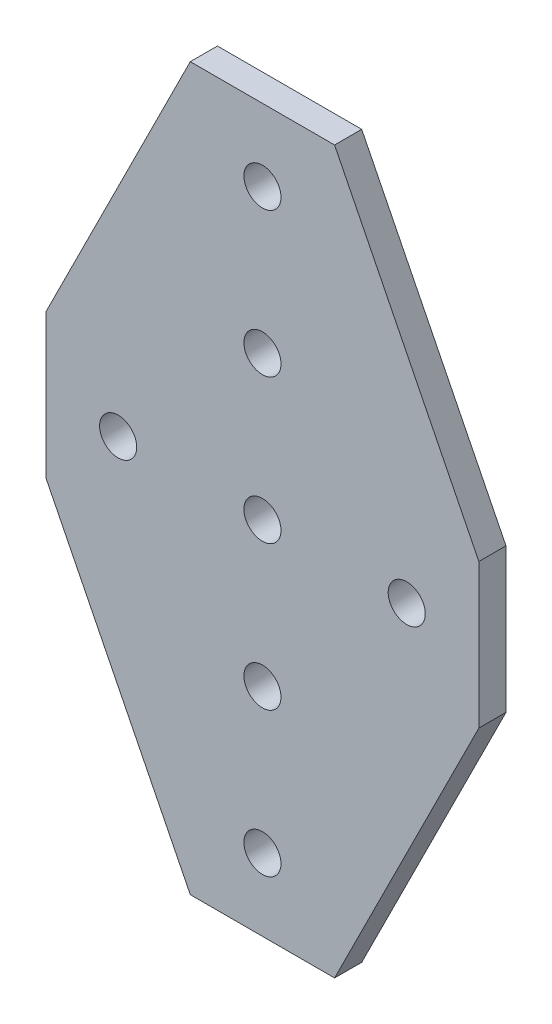
ISO-10303-21;
HEADER;
FILE_DESCRIPTION(('STEP AP214'),'2;1');
FILE_NAME('part.step','',(''),(''),'','','');
FILE_SCHEMA(('AUTOMOTIVE_DESIGN { 1 0 10303 214 1 1 1 1 }'));
ENDSEC;
DATA;
#1=APPLICATION_CONTEXT('core data for automotive mechanical design processes');
#2=APPLICATION_PROTOCOL_DEFINITION('international standard','automotive_design',2000,#1);
#3=PRODUCT_CONTEXT('',#1,'mechanical');
#4=PRODUCT('Part','Part','',(#3));
#5=PRODUCT_RELATED_PRODUCT_CATEGORY('part','',(#4));
#6=PRODUCT_DEFINITION_FORMATION('','',#4);
#7=PRODUCT_DEFINITION_CONTEXT('part definition',#1,'design');
#8=PRODUCT_DEFINITION('design','',#6,#7);
#9=PRODUCT_DEFINITION_SHAPE('','',#8);
#10=(LENGTH_UNIT() NAMED_UNIT(*) SI_UNIT(.MILLI.,.METRE.));
#11=(NAMED_UNIT(*) PLANE_ANGLE_UNIT() SI_UNIT($,.RADIAN.));
#12=(NAMED_UNIT(*) SI_UNIT($,.STERADIAN.) SOLID_ANGLE_UNIT());
#13=UNCERTAINTY_MEASURE_WITH_UNIT(LENGTH_MEASURE(1.E-05),#10,'distance_accuracy_value','');
#14=(GEOMETRIC_REPRESENTATION_CONTEXT(3) GLOBAL_UNCERTAINTY_ASSIGNED_CONTEXT((#13)) GLOBAL_UNIT_ASSIGNED_CONTEXT((#10,
#11,#12)) REPRESENTATION_CONTEXT('',''));
#15=CARTESIAN_POINT('',(0.,0.,0.));
#16=DIRECTION('',(0.,0.,1.));
#17=DIRECTION('',(1.,0.,0.));
#18=AXIS2_PLACEMENT_3D('',#15,#16,#17);
#19=CARTESIAN_POINT('',(-38.1,12.7,-2.3876));
#20=DIRECTION('',(-0.894427190999916,0.447213595499958,0.));
#21=DIRECTION('',(-0.447213595499958,-0.894427190999916,0.));
#22=AXIS2_PLACEMENT_3D('',#19,#20,#21);
#23=PLANE('',#22);
#24=DIRECTION('',(0.,0.,1.));
#25=VECTOR('',#24,1.);
#26=CARTESIAN_POINT('',(-38.1,12.7,-2.3876));
#27=LINE('',#26,#25);
#28=CARTESIAN_POINT('',(-38.1,12.7,-2.3876));
#29=VERTEX_POINT('',#28);
#30=CARTESIAN_POINT('',(-38.1,12.7,2.3876));
#31=VERTEX_POINT('',#30);
#32=EDGE_CURVE('E97',#29,#31,#27,.T.);
#33=ORIENTED_EDGE('',*,*,#32,.T.);
#34=DIRECTION('',(-0.447213595499958,-0.894427190999916,0.));
#35=VECTOR('',#34,1.);
#36=CARTESIAN_POINT('',(-38.1,12.7,2.3876));
#37=LINE('',#36,#35);
#38=CARTESIAN_POINT('',(-12.7,63.5,2.3876));
#39=VERTEX_POINT('',#38);
#40=EDGE_CURVE('E100',#39,#31,#37,.T.);
#41=ORIENTED_EDGE('',*,*,#40,.F.);
#42=DIRECTION('',(0.,0.,1.));
#43=VECTOR('',#42,1.);
#44=CARTESIAN_POINT('',(-12.7,63.5,-2.3876));
#45=LINE('',#44,#43);
#46=CARTESIAN_POINT('',(-12.7,63.5,-2.3876));
#47=VERTEX_POINT('',#46);
#48=EDGE_CURVE('E11',#47,#39,#45,.T.);
#49=ORIENTED_EDGE('',*,*,#48,.F.);
#50=DIRECTION('',(-0.447213595499958,-0.894427190999916,0.));
#51=VECTOR('',#50,1.);
#52=CARTESIAN_POINT('',(-38.1,12.7,-2.3876));
#53=LINE('',#52,#51);
#54=EDGE_CURVE('E101',#47,#29,#53,.T.);
#55=ORIENTED_EDGE('',*,*,#54,.T.);
#56=EDGE_LOOP('',(#33,#41,#49,#55));
#57=FACE_BOUND('',#56,.T.);
#58=ADVANCED_FACE('F35',(#57),#23,.T.);
#59=CARTESIAN_POINT('',(-12.7,63.5,-2.3876));
#60=DIRECTION('',(0.,1.,0.));
#61=DIRECTION('',(-1.,0.,0.));
#62=AXIS2_PLACEMENT_3D('',#59,#60,#61);
#63=PLANE('',#62);
#64=ORIENTED_EDGE('',*,*,#48,.T.);
#65=DIRECTION('',(-1.,0.,0.));
#66=VECTOR('',#65,1.);
#67=CARTESIAN_POINT('',(-12.7,63.5,2.3876));
#68=LINE('',#67,#66);
#69=CARTESIAN_POINT('',(12.7,63.5,2.3876));
#70=VERTEX_POINT('',#69);
#71=EDGE_CURVE('E119',#70,#39,#68,.T.);
#72=ORIENTED_EDGE('',*,*,#71,.F.);
#73=DIRECTION('',(0.,0.,1.));
#74=VECTOR('',#73,1.);
#75=CARTESIAN_POINT('',(12.7,63.5,-2.3876));
#76=LINE('',#75,#74);
#77=CARTESIAN_POINT('',(12.7,63.5,-2.3876));
#78=VERTEX_POINT('',#77);
#79=EDGE_CURVE('E43',#78,#70,#76,.T.);
#80=ORIENTED_EDGE('',*,*,#79,.F.);
#81=DIRECTION('',(-1.,0.,0.));
#82=VECTOR('',#81,1.);
#83=CARTESIAN_POINT('',(-12.7,63.5,-2.3876));
#84=LINE('',#83,#82);
#85=EDGE_CURVE('E106',#78,#47,#84,.T.);
#86=ORIENTED_EDGE('',*,*,#85,.T.);
#87=EDGE_LOOP('',(#64,#72,#80,#86));
#88=FACE_BOUND('',#87,.T.);
#89=ADVANCED_FACE('F200',(#88),#63,.T.);
#90=CARTESIAN_POINT('',(12.7,63.5,-2.3876));
#91=DIRECTION('',(0.894427190999916,0.447213595499958,0.));
#92=DIRECTION('',(-0.447213595499958,0.894427190999916,0.));
#93=AXIS2_PLACEMENT_3D('',#90,#91,#92);
#94=PLANE('',#93);
#95=ORIENTED_EDGE('',*,*,#79,.T.);
#96=DIRECTION('',(-0.447213595499958,0.894427190999916,0.));
#97=VECTOR('',#96,1.);
#98=CARTESIAN_POINT('',(12.7,63.5,2.3876));
#99=LINE('',#98,#97);
#100=CARTESIAN_POINT('',(38.1,12.7,2.3876));
#101=VERTEX_POINT('',#100);
#102=EDGE_CURVE('E137',#101,#70,#99,.T.);
#103=ORIENTED_EDGE('',*,*,#102,.F.);
#104=DIRECTION('',(0.,0.,1.));
#105=VECTOR('',#104,1.);
#106=CARTESIAN_POINT('',(38.1,12.7,-2.3876));
#107=LINE('',#106,#105);
#108=CARTESIAN_POINT('',(38.1,12.7,-2.3876));
#109=VERTEX_POINT('',#108);
#110=EDGE_CURVE('E159',#109,#101,#107,.T.);
#111=ORIENTED_EDGE('',*,*,#110,.F.);
#112=DIRECTION('',(-0.447213595499958,0.894427190999916,0.));
#113=VECTOR('',#112,1.);
#114=CARTESIAN_POINT('',(12.7,63.5,-2.3876));
#115=LINE('',#114,#113);
#116=EDGE_CURVE('E155',#109,#78,#115,.T.);
#117=ORIENTED_EDGE('',*,*,#116,.T.);
#118=EDGE_LOOP('',(#95,#103,#111,#117));
#119=FACE_BOUND('',#118,.T.);
#120=ADVANCED_FACE('F204',(#119),#94,.T.);
#121=CARTESIAN_POINT('',(38.1,12.7,-2.3876));
#122=DIRECTION('',(1.,0.,0.));
#123=DIRECTION('',(0.,1.,0.));
#124=AXIS2_PLACEMENT_3D('',#121,#122,#123);
#125=PLANE('',#124);
#126=ORIENTED_EDGE('',*,*,#110,.T.);
#127=DIRECTION('',(0.,1.,0.));
#128=VECTOR('',#127,1.);
#129=CARTESIAN_POINT('',(38.1,12.7,2.3876));
#130=LINE('',#129,#128);
#131=CARTESIAN_POINT('',(38.1,-12.7,2.3876));
#132=VERTEX_POINT('',#131);
#133=EDGE_CURVE('E134',#132,#101,#130,.T.);
#134=ORIENTED_EDGE('',*,*,#133,.F.);
#135=DIRECTION('',(0.,0.,1.));
#136=VECTOR('',#135,1.);
#137=CARTESIAN_POINT('',(38.1,-12.7,-2.3876));
#138=LINE('',#137,#136);
#139=CARTESIAN_POINT('',(38.1,-12.7,-2.3876));
#140=VERTEX_POINT('',#139);
#141=EDGE_CURVE('E161',#140,#132,#138,.T.);
#142=ORIENTED_EDGE('',*,*,#141,.F.);
#143=DIRECTION('',(0.,1.,0.));
#144=VECTOR('',#143,1.);
#145=CARTESIAN_POINT('',(38.1,12.7,-2.3876));
#146=LINE('',#145,#144);
#147=EDGE_CURVE('E152',#140,#109,#146,.T.);
#148=ORIENTED_EDGE('',*,*,#147,.T.);
#149=EDGE_LOOP('',(#126,#134,#142,#148));
#150=FACE_BOUND('',#149,.T.);
#151=ADVANCED_FACE('F209',(#150),#125,.T.);
#152=CARTESIAN_POINT('',(38.1,-12.7,-2.3876));
#153=DIRECTION('',(0.894427190999916,-0.447213595499958,0.));
#154=DIRECTION('',(0.447213595499958,0.894427190999916,0.));
#155=AXIS2_PLACEMENT_3D('',#152,#153,#154);
#156=PLANE('',#155);
#157=ORIENTED_EDGE('',*,*,#141,.T.);
#158=DIRECTION('',(0.447213595499958,0.894427190999916,0.));
#159=VECTOR('',#158,1.);
#160=CARTESIAN_POINT('',(38.1,-12.7,2.3876));
#161=LINE('',#160,#159);
#162=CARTESIAN_POINT('',(12.7,-63.5,2.3876));
#163=VERTEX_POINT('',#162);
#164=EDGE_CURVE('E131',#163,#132,#161,.T.);
#165=ORIENTED_EDGE('',*,*,#164,.F.);
#166=DIRECTION('',(0.,0.,1.));
#167=VECTOR('',#166,1.);
#168=CARTESIAN_POINT('',(12.7,-63.5,-2.3876));
#169=LINE('',#168,#167);
#170=CARTESIAN_POINT('',(12.7,-63.5,-2.3876));
#171=VERTEX_POINT('',#170);
#172=EDGE_CURVE('E163',#171,#163,#169,.T.);
#173=ORIENTED_EDGE('',*,*,#172,.F.);
#174=DIRECTION('',(0.447213595499958,0.894427190999916,0.));
#175=VECTOR('',#174,1.);
#176=CARTESIAN_POINT('',(38.1,-12.7,-2.3876));
#177=LINE('',#176,#175);
#178=EDGE_CURVE('E149',#171,#140,#177,.T.);
#179=ORIENTED_EDGE('',*,*,#178,.T.);
#180=EDGE_LOOP('',(#157,#165,#173,#179));
#181=FACE_BOUND('',#180,.T.);
#182=ADVANCED_FACE('F218',(#181),#156,.T.);
#183=CARTESIAN_POINT('',(12.7,-63.5,-2.3876));
#184=DIRECTION('',(0.,-1.,0.));
#185=DIRECTION('',(0.,0.,-1.));
#186=AXIS2_PLACEMENT_3D('',#183,#184,#185);
#187=PLANE('',#186);
#188=ORIENTED_EDGE('',*,*,#172,.T.);
#189=DIRECTION('',(1.,0.,0.));
#190=VECTOR('',#189,1.);
#191=CARTESIAN_POINT('',(12.7,-63.5,2.3876));
#192=LINE('',#191,#190);
#193=CARTESIAN_POINT('',(-12.7,-63.5,2.3876));
#194=VERTEX_POINT('',#193);
#195=EDGE_CURVE('E128',#194,#163,#192,.T.);
#196=ORIENTED_EDGE('',*,*,#195,.F.);
#197=DIRECTION('',(0.,0.,1.));
#198=VECTOR('',#197,1.);
#199=CARTESIAN_POINT('',(-12.7,-63.5,-2.3876));
#200=LINE('',#199,#198);
#201=CARTESIAN_POINT('',(-12.7,-63.5,-2.3876));
#202=VERTEX_POINT('',#201);
#203=EDGE_CURVE('E165',#202,#194,#200,.T.);
#204=ORIENTED_EDGE('',*,*,#203,.F.);
#205=DIRECTION('',(1.,0.,0.));
#206=VECTOR('',#205,1.);
#207=CARTESIAN_POINT('',(12.7,-63.5,-2.3876));
#208=LINE('',#207,#206);
#209=EDGE_CURVE('E146',#202,#171,#208,.T.);
#210=ORIENTED_EDGE('',*,*,#209,.T.);
#211=EDGE_LOOP('',(#188,#196,#204,#210));
#212=FACE_BOUND('',#211,.T.);
#213=ADVANCED_FACE('F222',(#212),#187,.T.);
#214=CARTESIAN_POINT('',(-12.7,-63.5,-2.3876));
#215=DIRECTION('',(-0.894427190999916,-0.447213595499958,0.));
#216=DIRECTION('',(0.447213595499958,-0.894427190999916,0.));
#217=AXIS2_PLACEMENT_3D('',#214,#215,#216);
#218=PLANE('',#217);
#219=ORIENTED_EDGE('',*,*,#203,.T.);
#220=DIRECTION('',(0.447213595499958,-0.894427190999916,0.));
#221=VECTOR('',#220,1.);
#222=CARTESIAN_POINT('',(-12.7,-63.5,2.3876));
#223=LINE('',#222,#221);
#224=CARTESIAN_POINT('',(-38.1,-12.7,2.3876));
#225=VERTEX_POINT('',#224);
#226=EDGE_CURVE('E114',#225,#194,#223,.T.);
#227=ORIENTED_EDGE('',*,*,#226,.F.);
#228=DIRECTION('',(0.,0.,1.));
#229=VECTOR('',#228,1.);
#230=CARTESIAN_POINT('',(-38.1,-12.7,-2.3876));
#231=LINE('',#230,#229);
#232=CARTESIAN_POINT('',(-38.1,-12.7,-2.3876));
#233=VERTEX_POINT('',#232);
#234=EDGE_CURVE('E105',#233,#225,#231,.T.);
#235=ORIENTED_EDGE('',*,*,#234,.F.);
#236=DIRECTION('',(0.447213595499958,-0.894427190999916,0.));
#237=VECTOR('',#236,1.);
#238=CARTESIAN_POINT('',(-12.7,-63.5,-2.3876));
#239=LINE('',#238,#237);
#240=EDGE_CURVE('E143',#233,#202,#239,.T.);
#241=ORIENTED_EDGE('',*,*,#240,.T.);
#242=EDGE_LOOP('',(#219,#227,#235,#241));
#243=FACE_BOUND('',#242,.T.);
#244=ADVANCED_FACE('F226',(#243),#218,.T.);
#245=CARTESIAN_POINT('',(-38.1,-12.7,-2.3876));
#246=DIRECTION('',(-1.,0.,0.));
#247=DIRECTION('',(0.,0.,1.));
#248=AXIS2_PLACEMENT_3D('',#245,#246,#247);
#249=PLANE('',#248);
#250=ORIENTED_EDGE('',*,*,#234,.T.);
#251=DIRECTION('',(0.,-1.,0.));
#252=VECTOR('',#251,1.);
#253=CARTESIAN_POINT('',(-38.1,-12.7,2.3876));
#254=LINE('',#253,#252);
#255=EDGE_CURVE('E109',#31,#225,#254,.T.);
#256=ORIENTED_EDGE('',*,*,#255,.F.);
#257=ORIENTED_EDGE('',*,*,#32,.F.);
#258=DIRECTION('',(0.,-1.,0.));
#259=VECTOR('',#258,1.);
#260=CARTESIAN_POINT('',(-38.1,-12.7,-2.3876));
#261=LINE('',#260,#259);
#262=EDGE_CURVE('E141',#29,#233,#261,.T.);
#263=ORIENTED_EDGE('',*,*,#262,.T.);
#264=EDGE_LOOP('',(#250,#256,#257,#263));
#265=FACE_BOUND('',#264,.T.);
#266=ADVANCED_FACE('F110',(#265),#249,.T.);
#267=CARTESIAN_POINT('',(0.,0.,-2.3876));
#268=DIRECTION('',(0.,0.,-1.));
#269=DIRECTION('',(-1.,0.,0.));
#270=AXIS2_PLACEMENT_3D('',#267,#268,#269);
#271=PLANE('',#270);
#272=CARTESIAN_POINT('',(25.4,0.,-2.3876));
#273=DIRECTION('',(0.,0.,1.));
#274=DIRECTION('',(1.,0.,0.));
#275=AXIS2_PLACEMENT_3D('',#272,#273,#274);
#276=CIRCLE('',#275,3.2639);
#277=CARTESIAN_POINT('',(28.6639,0.,-2.3876));
#278=VERTEX_POINT('',#277);
#279=EDGE_CURVE('E243',#278,#278,#276,.T.);
#280=ORIENTED_EDGE('',*,*,#279,.T.);
#281=EDGE_LOOP('',(#280));
#282=FACE_BOUND('',#281,.T.);
#283=CARTESIAN_POINT('',(-25.4,0.,-2.3876));
#284=DIRECTION('',(0.,0.,1.));
#285=DIRECTION('',(-1.,0.,0.));
#286=AXIS2_PLACEMENT_3D('',#283,#284,#285);
#287=CIRCLE('',#286,3.2639);
#288=CARTESIAN_POINT('',(-28.6639,0.,-2.3876));
#289=VERTEX_POINT('',#288);
#290=EDGE_CURVE('E247',#289,#289,#287,.T.);
#291=ORIENTED_EDGE('',*,*,#290,.T.);
#292=EDGE_LOOP('',(#291));
#293=FACE_BOUND('',#292,.T.);
#294=CARTESIAN_POINT('',(0.,50.8,-2.3876));
#295=DIRECTION('',(0.,0.,1.));
#296=DIRECTION('',(1.,0.,0.));
#297=AXIS2_PLACEMENT_3D('',#294,#295,#296);
#298=CIRCLE('',#297,3.2639);
#299=CARTESIAN_POINT('',(3.2639,50.8,-2.3876));
#300=VERTEX_POINT('',#299);
#301=EDGE_CURVE('E172',#300,#300,#298,.T.);
#302=ORIENTED_EDGE('',*,*,#301,.T.);
#303=EDGE_LOOP('',(#302));
#304=FACE_BOUND('',#303,.T.);
#305=CARTESIAN_POINT('',(2.66050878019847E-13,25.4,-2.3876));
#306=DIRECTION('',(0.,0.,1.));
#307=DIRECTION('',(1.,0.,0.));
#308=AXIS2_PLACEMENT_3D('',#305,#306,#307);
#309=CIRCLE('',#308,3.2639);
#310=CARTESIAN_POINT('',(3.26390000000027,25.4,-2.3876));
#311=VERTEX_POINT('',#310);
#312=EDGE_CURVE('E253',#311,#311,#309,.T.);
#313=ORIENTED_EDGE('',*,*,#312,.T.);
#314=EDGE_LOOP('',(#313));
#315=FACE_BOUND('',#314,.T.);
#316=CARTESIAN_POINT('',(5.32101756039693E-13,0.,-2.3876));
#317=DIRECTION('',(0.,0.,1.));
#318=DIRECTION('',(1.,0.,0.));
#319=AXIS2_PLACEMENT_3D('',#316,#317,#318);
#320=CIRCLE('',#319,3.2639);
#321=CARTESIAN_POINT('',(3.26390000000053,0.,-2.3876));
#322=VERTEX_POINT('',#321);
#323=EDGE_CURVE('E257',#322,#322,#320,.T.);
#324=ORIENTED_EDGE('',*,*,#323,.T.);
#325=EDGE_LOOP('',(#324));
#326=FACE_BOUND('',#325,.T.);
#327=CARTESIAN_POINT('',(7.9815263405954E-13,-25.4,-2.3876));
#328=DIRECTION('',(0.,0.,1.));
#329=DIRECTION('',(1.,0.,0.));
#330=AXIS2_PLACEMENT_3D('',#327,#328,#329);
#331=CIRCLE('',#330,3.2639);
#332=CARTESIAN_POINT('',(3.2639000000008,-25.4,-2.3876));
#333=VERTEX_POINT('',#332);
#334=EDGE_CURVE('E261',#333,#333,#331,.T.);
#335=ORIENTED_EDGE('',*,*,#334,.T.);
#336=EDGE_LOOP('',(#335));
#337=FACE_BOUND('',#336,.T.);
#338=CARTESIAN_POINT('',(1.06420351207939E-12,-50.8,-2.3876));
#339=DIRECTION('',(0.,0.,1.));
#340=DIRECTION('',(1.,0.,0.));
#341=AXIS2_PLACEMENT_3D('',#338,#339,#340);
#342=CIRCLE('',#341,3.2639);
#343=CARTESIAN_POINT('',(3.26390000000107,-50.8,-2.3876));
#344=VERTEX_POINT('',#343);
#345=EDGE_CURVE('E124',#344,#344,#342,.T.);
#346=ORIENTED_EDGE('',*,*,#345,.T.);
#347=EDGE_LOOP('',(#346));
#348=FACE_BOUND('',#347,.T.);
#349=ORIENTED_EDGE('',*,*,#54,.F.);
#350=ORIENTED_EDGE('',*,*,#85,.F.);
#351=ORIENTED_EDGE('',*,*,#116,.F.);
#352=ORIENTED_EDGE('',*,*,#147,.F.);
#353=ORIENTED_EDGE('',*,*,#178,.F.);
#354=ORIENTED_EDGE('',*,*,#209,.F.);
#355=ORIENTED_EDGE('',*,*,#240,.F.);
#356=ORIENTED_EDGE('',*,*,#262,.F.);
#357=EDGE_LOOP('',(#349,#350,#351,#352,#353,#354,#355,#356));
#358=FACE_BOUND('',#357,.T.);
#359=ADVANCED_FACE('F213',(#282,#293,#304,#315,#326,#337,#348,#358),#271,.T.);
#360=CARTESIAN_POINT('',(0.,0.,2.3876));
#361=DIRECTION('',(0.,0.,-1.));
#362=DIRECTION('',(-1.,0.,0.));
#363=AXIS2_PLACEMENT_3D('',#360,#361,#362);
#364=PLANE('',#363);
#365=CARTESIAN_POINT('',(25.4,0.,2.3876));
#366=DIRECTION('',(0.,0.,1.));
#367=DIRECTION('',(1.,0.,0.));
#368=AXIS2_PLACEMENT_3D('',#365,#366,#367);
#369=CIRCLE('',#368,3.2639);
#370=CARTESIAN_POINT('',(28.6639,0.,2.3876));
#371=VERTEX_POINT('',#370);
#372=EDGE_CURVE('E276',#371,#371,#369,.T.);
#373=ORIENTED_EDGE('',*,*,#372,.F.);
#374=EDGE_LOOP('',(#373));
#375=FACE_BOUND('',#374,.T.);
#376=CARTESIAN_POINT('',(-25.4,0.,2.3876));
#377=DIRECTION('',(0.,0.,1.));
#378=DIRECTION('',(-1.,0.,0.));
#379=AXIS2_PLACEMENT_3D('',#376,#377,#378);
#380=CIRCLE('',#379,3.2639);
#381=CARTESIAN_POINT('',(-28.6639,0.,2.3876));
#382=VERTEX_POINT('',#381);
#383=EDGE_CURVE('E282',#382,#382,#380,.T.);
#384=ORIENTED_EDGE('',*,*,#383,.F.);
#385=EDGE_LOOP('',(#384));
#386=FACE_BOUND('',#385,.T.);
#387=CARTESIAN_POINT('',(0.,50.8,2.3876));
#388=DIRECTION('',(0.,0.,-1.));
#389=DIRECTION('',(-1.,0.,0.));
#390=AXIS2_PLACEMENT_3D('',#387,#388,#389);
#391=CIRCLE('',#390,3.2639);
#392=CARTESIAN_POINT('',(-3.2639,50.8,2.3876));
#393=VERTEX_POINT('',#392);
#394=EDGE_CURVE('E38',#393,#393,#391,.T.);
#395=ORIENTED_EDGE('',*,*,#394,.T.);
#396=EDGE_LOOP('',(#395));
#397=FACE_BOUND('',#396,.T.);
#398=CARTESIAN_POINT('',(2.66050878019847E-13,25.4,2.3876));
#399=DIRECTION('',(0.,0.,-1.));
#400=DIRECTION('',(-1.,0.,0.));
#401=AXIS2_PLACEMENT_3D('',#398,#399,#400);
#402=CIRCLE('',#401,3.2639);
#403=CARTESIAN_POINT('',(-3.26389999999974,25.4,2.3876));
#404=VERTEX_POINT('',#403);
#405=EDGE_CURVE('E122',#404,#404,#402,.T.);
#406=ORIENTED_EDGE('',*,*,#405,.T.);
#407=EDGE_LOOP('',(#406));
#408=FACE_BOUND('',#407,.T.);
#409=CARTESIAN_POINT('',(5.32101756039693E-13,0.,2.3876));
#410=DIRECTION('',(0.,0.,-1.));
#411=DIRECTION('',(-1.,0.,0.));
#412=AXIS2_PLACEMENT_3D('',#409,#410,#411);
#413=CIRCLE('',#412,3.2639);
#414=CARTESIAN_POINT('',(-3.26389999999947,0.,2.3876));
#415=VERTEX_POINT('',#414);
#416=EDGE_CURVE('E175',#415,#415,#413,.T.);
#417=ORIENTED_EDGE('',*,*,#416,.T.);
#418=EDGE_LOOP('',(#417));
#419=FACE_BOUND('',#418,.T.);
#420=CARTESIAN_POINT('',(7.9815263405954E-13,-25.4,2.3876));
#421=DIRECTION('',(0.,0.,-1.));
#422=DIRECTION('',(-1.,0.,0.));
#423=AXIS2_PLACEMENT_3D('',#420,#421,#422);
#424=CIRCLE('',#423,3.2639);
#425=CARTESIAN_POINT('',(-3.2638999999992,-25.4,2.3876));
#426=VERTEX_POINT('',#425);
#427=EDGE_CURVE('E171',#426,#426,#424,.T.);
#428=ORIENTED_EDGE('',*,*,#427,.T.);
#429=EDGE_LOOP('',(#428));
#430=FACE_BOUND('',#429,.T.);
#431=CARTESIAN_POINT('',(1.06420351207939E-12,-50.8,2.3876));
#432=DIRECTION('',(0.,0.,-1.));
#433=DIRECTION('',(-1.,0.,0.));
#434=AXIS2_PLACEMENT_3D('',#431,#432,#433);
#435=CIRCLE('',#434,3.2639);
#436=CARTESIAN_POINT('',(-3.26389999999894,-50.8,2.3876));
#437=VERTEX_POINT('',#436);
#438=EDGE_CURVE('E168',#437,#437,#435,.T.);
#439=ORIENTED_EDGE('',*,*,#438,.T.);
#440=EDGE_LOOP('',(#439));
#441=FACE_BOUND('',#440,.T.);
#442=ORIENTED_EDGE('',*,*,#40,.T.);
#443=ORIENTED_EDGE('',*,*,#255,.T.);
#444=ORIENTED_EDGE('',*,*,#226,.T.);
#445=ORIENTED_EDGE('',*,*,#195,.T.);
#446=ORIENTED_EDGE('',*,*,#164,.T.);
#447=ORIENTED_EDGE('',*,*,#133,.T.);
#448=ORIENTED_EDGE('',*,*,#102,.T.);
#449=ORIENTED_EDGE('',*,*,#71,.T.);
#450=EDGE_LOOP('',(#442,#443,#444,#445,#446,#447,#448,#449));
#451=FACE_BOUND('',#450,.T.);
#452=ADVANCED_FACE('F117',(#375,#386,#397,#408,#419,#430,#441,#451),#364,.F.);
#453=CARTESIAN_POINT('',(1.06420351207939E-12,-50.8,-2.3876));
#454=DIRECTION('',(0.,0.,1.));
#455=DIRECTION('',(1.,0.,0.));
#456=AXIS2_PLACEMENT_3D('',#453,#454,#455);
#457=CYLINDRICAL_SURFACE('',#456,3.2639);
#458=ORIENTED_EDGE('',*,*,#345,.F.);
#459=EDGE_LOOP('',(#458));
#460=FACE_BOUND('',#459,.T.);
#461=ORIENTED_EDGE('',*,*,#438,.F.);
#462=EDGE_LOOP('',(#461));
#463=FACE_BOUND('',#462,.T.);
#464=ADVANCED_FACE('F238',(#460,#463),#457,.F.);
#465=CARTESIAN_POINT('',(7.9815263405954E-13,-25.4,-2.3876));
#466=DIRECTION('',(0.,0.,1.));
#467=DIRECTION('',(1.,0.,0.));
#468=AXIS2_PLACEMENT_3D('',#465,#466,#467);
#469=CYLINDRICAL_SURFACE('',#468,3.2639);
#470=ORIENTED_EDGE('',*,*,#334,.F.);
#471=EDGE_LOOP('',(#470));
#472=FACE_BOUND('',#471,.T.);
#473=ORIENTED_EDGE('',*,*,#427,.F.);
#474=EDGE_LOOP('',(#473));
#475=FACE_BOUND('',#474,.T.);
#476=ADVANCED_FACE('F195',(#472,#475),#469,.F.);
#477=CARTESIAN_POINT('',(5.32101756039693E-13,0.,-2.3876));
#478=DIRECTION('',(0.,0.,1.));
#479=DIRECTION('',(1.,0.,0.));
#480=AXIS2_PLACEMENT_3D('',#477,#478,#479);
#481=CYLINDRICAL_SURFACE('',#480,3.2639);
#482=ORIENTED_EDGE('',*,*,#323,.F.);
#483=EDGE_LOOP('',(#482));
#484=FACE_BOUND('',#483,.T.);
#485=ORIENTED_EDGE('',*,*,#416,.F.);
#486=EDGE_LOOP('',(#485));
#487=FACE_BOUND('',#486,.T.);
#488=ADVANCED_FACE('F185',(#484,#487),#481,.F.);
#489=CARTESIAN_POINT('',(2.66050878019847E-13,25.4,-2.3876));
#490=DIRECTION('',(0.,0.,1.));
#491=DIRECTION('',(1.,0.,0.));
#492=AXIS2_PLACEMENT_3D('',#489,#490,#491);
#493=CYLINDRICAL_SURFACE('',#492,3.2639);
#494=ORIENTED_EDGE('',*,*,#312,.F.);
#495=EDGE_LOOP('',(#494));
#496=FACE_BOUND('',#495,.T.);
#497=ORIENTED_EDGE('',*,*,#405,.F.);
#498=EDGE_LOOP('',(#497));
#499=FACE_BOUND('',#498,.T.);
#500=ADVANCED_FACE('F182',(#496,#499),#493,.F.);
#501=CARTESIAN_POINT('',(0.,50.8,-2.3876));
#502=DIRECTION('',(0.,0.,1.));
#503=DIRECTION('',(1.,0.,0.));
#504=AXIS2_PLACEMENT_3D('',#501,#502,#503);
#505=CYLINDRICAL_SURFACE('',#504,3.2639);
#506=ORIENTED_EDGE('',*,*,#301,.F.);
#507=EDGE_LOOP('',(#506));
#508=FACE_BOUND('',#507,.T.);
#509=ORIENTED_EDGE('',*,*,#394,.F.);
#510=EDGE_LOOP('',(#509));
#511=FACE_BOUND('',#510,.T.);
#512=ADVANCED_FACE('F184',(#508,#511),#505,.F.);
#513=CARTESIAN_POINT('',(-25.4,0.,-2.3876));
#514=DIRECTION('',(0.,0.,1.));
#515=DIRECTION('',(1.,0.,0.));
#516=AXIS2_PLACEMENT_3D('',#513,#514,#515);
#517=CYLINDRICAL_SURFACE('',#516,3.2639);
#518=ORIENTED_EDGE('',*,*,#290,.F.);
#519=EDGE_LOOP('',(#518));
#520=FACE_BOUND('',#519,.T.);
#521=ORIENTED_EDGE('',*,*,#383,.T.);
#522=EDGE_LOOP('',(#521));
#523=FACE_BOUND('',#522,.T.);
#524=ADVANCED_FACE('F192',(#520,#523),#517,.F.);
#525=CARTESIAN_POINT('',(25.4,0.,-2.3876));
#526=DIRECTION('',(0.,0.,1.));
#527=DIRECTION('',(1.,0.,0.));
#528=AXIS2_PLACEMENT_3D('',#525,#526,#527);
#529=CYLINDRICAL_SURFACE('',#528,3.2639);
#530=ORIENTED_EDGE('',*,*,#279,.F.);
#531=EDGE_LOOP('',(#530));
#532=FACE_BOUND('',#531,.T.);
#533=ORIENTED_EDGE('',*,*,#372,.T.);
#534=EDGE_LOOP('',(#533));
#535=FACE_BOUND('',#534,.T.);
#536=ADVANCED_FACE('F294',(#532,#535),#529,.F.);
#537=CLOSED_SHELL('',(#58,#89,#120,#151,#182,#213,#244,#266,#359,#452,#464,#476,#488,#500,#512,
#524,#536));
#538=MANIFOLD_SOLID_BREP('B2',#537);
#539=ADVANCED_BREP_SHAPE_REPRESENTATION('',(#18,#538),#14);
#540=SHAPE_DEFINITION_REPRESENTATION(#9,#539);
ENDSEC;
END-ISO-10303-21;
